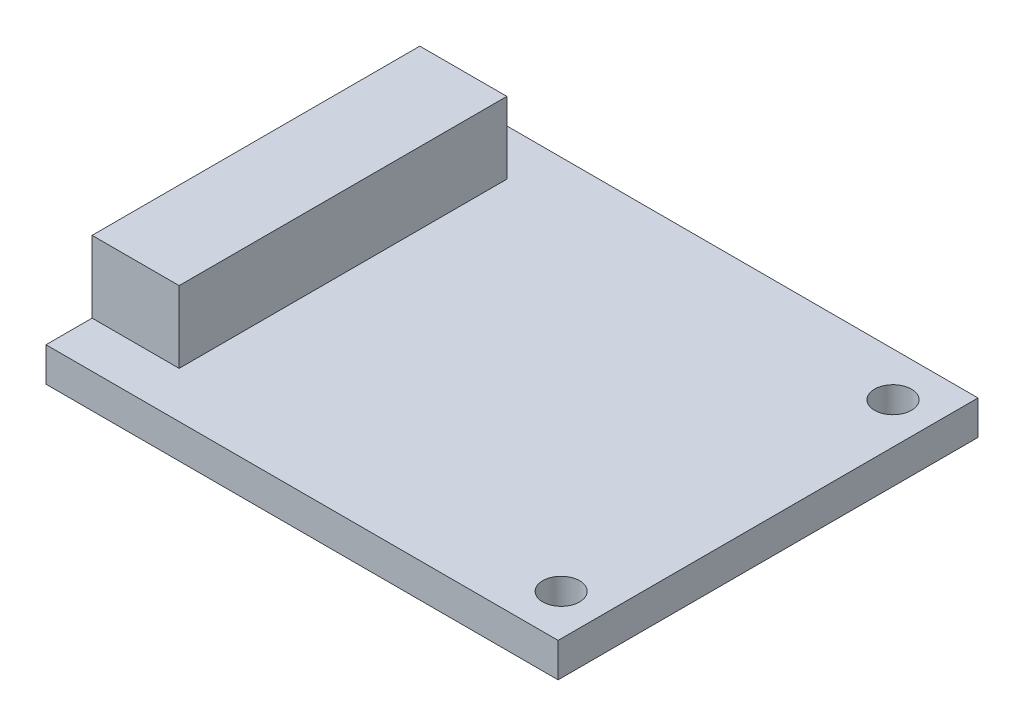
ISO-10303-21;
HEADER;
FILE_DESCRIPTION(('STEP AP214'),'2;1');
FILE_NAME('part.step','',(''),(''),'','','');
FILE_SCHEMA(('AUTOMOTIVE_DESIGN { 1 0 10303 214 1 1 1 1 }'));
ENDSEC;
DATA;
#1=APPLICATION_CONTEXT('core data for automotive mechanical design processes');
#2=APPLICATION_PROTOCOL_DEFINITION('international standard','automotive_design',2000,#1);
#3=PRODUCT_CONTEXT('',#1,'mechanical');
#4=PRODUCT('Part','Part','',(#3));
#5=PRODUCT_RELATED_PRODUCT_CATEGORY('part','',(#4));
#6=PRODUCT_DEFINITION_FORMATION('','',#4);
#7=PRODUCT_DEFINITION_CONTEXT('part definition',#1,'design');
#8=PRODUCT_DEFINITION('design','',#6,#7);
#9=PRODUCT_DEFINITION_SHAPE('','',#8);
#10=(LENGTH_UNIT() NAMED_UNIT(*) SI_UNIT(.MILLI.,.METRE.));
#11=(NAMED_UNIT(*) PLANE_ANGLE_UNIT() SI_UNIT($,.RADIAN.));
#12=(NAMED_UNIT(*) SI_UNIT($,.STERADIAN.) SOLID_ANGLE_UNIT());
#13=UNCERTAINTY_MEASURE_WITH_UNIT(LENGTH_MEASURE(1.E-05),#10,'distance_accuracy_value','');
#14=(GEOMETRIC_REPRESENTATION_CONTEXT(3) GLOBAL_UNCERTAINTY_ASSIGNED_CONTEXT((#13)) GLOBAL_UNIT_ASSIGNED_CONTEXT((#10,
#11,#12)) REPRESENTATION_CONTEXT('',''));
#15=CARTESIAN_POINT('',(0.,0.,0.));
#16=DIRECTION('',(0.,0.,1.));
#17=DIRECTION('',(1.,0.,0.));
#18=AXIS2_PLACEMENT_3D('',#15,#16,#17);
#19=CARTESIAN_POINT('',(0.,1.67,0.));
#20=DIRECTION('',(0.,-1.,0.));
#21=DIRECTION('',(0.,0.,-1.));
#22=AXIS2_PLACEMENT_3D('',#19,#20,#21);
#23=PLANE('',#22);
#24=CARTESIAN_POINT('',(23.,1.67,-2.15));
#25=DIRECTION('',(0.,1.,0.));
#26=DIRECTION('',(0.,0.,1.));
#27=AXIS2_PLACEMENT_3D('',#24,#25,#26);
#28=CIRCLE('',#27,0.899999999999998);
#29=CARTESIAN_POINT('',(23.,1.67,-1.25));
#30=VERTEX_POINT('',#29);
#31=EDGE_CURVE('E144',#30,#30,#28,.T.);
#32=ORIENTED_EDGE('',*,*,#31,.F.);
#33=EDGE_LOOP('',(#32));
#34=FACE_BOUND('',#33,.T.);
#35=CARTESIAN_POINT('',(23.,1.67,-18.35));
#36=DIRECTION('',(0.,1.,0.));
#37=DIRECTION('',(0.,0.,1.));
#38=AXIS2_PLACEMENT_3D('',#35,#36,#37);
#39=CIRCLE('',#38,0.899999999999998);
#40=CARTESIAN_POINT('',(23.,1.67,-17.45));
#41=VERTEX_POINT('',#40);
#42=EDGE_CURVE('E130',#41,#41,#39,.T.);
#43=ORIENTED_EDGE('',*,*,#42,.F.);
#44=EDGE_LOOP('',(#43));
#45=FACE_BOUND('',#44,.T.);
#46=DIRECTION('',(-1.,0.,0.));
#47=VECTOR('',#46,1.);
#48=CARTESIAN_POINT('',(0.,1.67,-18.25));
#49=LINE('',#48,#47);
#50=CARTESIAN_POINT('',(4.25,1.67,-18.25));
#51=VERTEX_POINT('',#50);
#52=CARTESIAN_POINT('',(0.,1.67,-18.25));
#53=VERTEX_POINT('',#52);
#54=EDGE_CURVE('E55',#51,#53,#49,.T.);
#55=ORIENTED_EDGE('',*,*,#54,.F.);
#56=DIRECTION('',(0.,0.,-1.));
#57=VECTOR('',#56,1.);
#58=CARTESIAN_POINT('',(4.25,1.67,-2.25));
#59=LINE('',#58,#57);
#60=CARTESIAN_POINT('',(4.25,1.67,-2.25));
#61=VERTEX_POINT('',#60);
#62=EDGE_CURVE('E208',#61,#51,#59,.T.);
#63=ORIENTED_EDGE('',*,*,#62,.F.);
#64=DIRECTION('',(1.,0.,0.));
#65=VECTOR('',#64,1.);
#66=CARTESIAN_POINT('',(0.,1.67,-2.25));
#67=LINE('',#66,#65);
#68=CARTESIAN_POINT('',(0.,1.67,-2.25));
#69=VERTEX_POINT('',#68);
#70=EDGE_CURVE('E61',#69,#61,#67,.T.);
#71=ORIENTED_EDGE('',*,*,#70,.F.);
#72=DIRECTION('',(0.,0.,1.));
#73=VECTOR('',#72,1.);
#74=CARTESIAN_POINT('',(0.,1.67,0.));
#75=LINE('',#74,#73);
#76=CARTESIAN_POINT('',(0.,1.67,0.));
#77=VERTEX_POINT('',#76);
#78=EDGE_CURVE('E128',#69,#77,#75,.T.);
#79=ORIENTED_EDGE('',*,*,#78,.T.);
#80=DIRECTION('',(1.,0.,0.));
#81=VECTOR('',#80,1.);
#82=CARTESIAN_POINT('',(0.,1.67,0.));
#83=LINE('',#82,#81);
#84=CARTESIAN_POINT('',(25.,1.67,0.));
#85=VERTEX_POINT('',#84);
#86=EDGE_CURVE('E156',#77,#85,#83,.T.);
#87=ORIENTED_EDGE('',*,*,#86,.T.);
#88=DIRECTION('',(0.,0.,-1.));
#89=VECTOR('',#88,1.);
#90=CARTESIAN_POINT('',(25.,1.67,0.));
#91=LINE('',#90,#89);
#92=CARTESIAN_POINT('',(25.,1.67,-20.5));
#93=VERTEX_POINT('',#92);
#94=EDGE_CURVE('E159',#85,#93,#91,.T.);
#95=ORIENTED_EDGE('',*,*,#94,.T.);
#96=DIRECTION('',(-1.,0.,0.));
#97=VECTOR('',#96,1.);
#98=CARTESIAN_POINT('',(0.,1.67,-20.5));
#99=LINE('',#98,#97);
#100=CARTESIAN_POINT('',(0.,1.67,-20.5));
#101=VERTEX_POINT('',#100);
#102=EDGE_CURVE('E162',#93,#101,#99,.T.);
#103=ORIENTED_EDGE('',*,*,#102,.T.);
#104=EDGE_CURVE('E153',#101,#53,#75,.T.);
#105=ORIENTED_EDGE('',*,*,#104,.T.);
#106=EDGE_LOOP('',(#55,#63,#71,#79,#87,#95,#103,#105));
#107=FACE_BOUND('',#106,.T.);
#108=ADVANCED_FACE('F39',(#34,#45,#107),#23,.F.);
#109=CARTESIAN_POINT('',(0.,1.67,0.));
#110=DIRECTION('',(1.,0.,0.));
#111=DIRECTION('',(0.,0.,-1.));
#112=AXIS2_PLACEMENT_3D('',#109,#110,#111);
#113=PLANE('',#112);
#114=DIRECTION('',(0.,0.,1.));
#115=VECTOR('',#114,1.);
#116=CARTESIAN_POINT('',(0.,0.,0.));
#117=LINE('',#116,#115);
#118=CARTESIAN_POINT('',(0.,0.,-20.5));
#119=VERTEX_POINT('',#118);
#120=CARTESIAN_POINT('',(0.,0.,0.));
#121=VERTEX_POINT('',#120);
#122=EDGE_CURVE('E152',#119,#121,#117,.T.);
#123=ORIENTED_EDGE('',*,*,#122,.T.);
#124=DIRECTION('',(0.,-1.,0.));
#125=VECTOR('',#124,1.);
#126=CARTESIAN_POINT('',(0.,1.67,0.));
#127=LINE('',#126,#125);
#128=EDGE_CURVE('E11',#77,#121,#127,.T.);
#129=ORIENTED_EDGE('',*,*,#128,.F.);
#130=ORIENTED_EDGE('',*,*,#78,.F.);
#131=DIRECTION('',(0.,-1.,0.));
#132=VECTOR('',#131,1.);
#133=CARTESIAN_POINT('',(0.,5.17,-2.25));
#134=LINE('',#133,#132);
#135=CARTESIAN_POINT('',(0.,5.17,-2.25));
#136=VERTEX_POINT('',#135);
#137=EDGE_CURVE('E108',#136,#69,#134,.T.);
#138=ORIENTED_EDGE('',*,*,#137,.F.);
#139=DIRECTION('',(0.,0.,1.));
#140=VECTOR('',#139,1.);
#141=CARTESIAN_POINT('',(0.,5.17,-2.25));
#142=LINE('',#141,#140);
#143=CARTESIAN_POINT('',(0.,5.17,-18.25));
#144=VERTEX_POINT('',#143);
#145=EDGE_CURVE('E115',#144,#136,#142,.T.);
#146=ORIENTED_EDGE('',*,*,#145,.F.);
#147=DIRECTION('',(0.,-1.,0.));
#148=VECTOR('',#147,1.);
#149=CARTESIAN_POINT('',(0.,5.17,-18.25));
#150=LINE('',#149,#148);
#151=EDGE_CURVE('E202',#144,#53,#150,.T.);
#152=ORIENTED_EDGE('',*,*,#151,.T.);
#153=ORIENTED_EDGE('',*,*,#104,.F.);
#154=DIRECTION('',(0.,-1.,0.));
#155=VECTOR('',#154,1.);
#156=CARTESIAN_POINT('',(0.,1.67,-20.5));
#157=LINE('',#156,#155);
#158=EDGE_CURVE('E165',#101,#119,#157,.T.);
#159=ORIENTED_EDGE('',*,*,#158,.T.);
#160=EDGE_LOOP('',(#123,#129,#130,#138,#146,#152,#153,#159));
#161=FACE_BOUND('',#160,.T.);
#162=ADVANCED_FACE('F41',(#161),#113,.F.);
#163=CARTESIAN_POINT('',(0.,1.67,0.));
#164=DIRECTION('',(0.,0.,-1.));
#165=DIRECTION('',(-1.,0.,0.));
#166=AXIS2_PLACEMENT_3D('',#163,#164,#165);
#167=PLANE('',#166);
#168=DIRECTION('',(1.,0.,0.));
#169=VECTOR('',#168,1.);
#170=CARTESIAN_POINT('',(0.,0.,0.));
#171=LINE('',#170,#169);
#172=CARTESIAN_POINT('',(25.,0.,0.));
#173=VERTEX_POINT('',#172);
#174=EDGE_CURVE('E168',#121,#173,#171,.T.);
#175=ORIENTED_EDGE('',*,*,#174,.T.);
#176=DIRECTION('',(0.,-1.,0.));
#177=VECTOR('',#176,1.);
#178=CARTESIAN_POINT('',(25.,1.67,0.));
#179=LINE('',#178,#177);
#180=EDGE_CURVE('E48',#85,#173,#179,.T.);
#181=ORIENTED_EDGE('',*,*,#180,.F.);
#182=ORIENTED_EDGE('',*,*,#86,.F.);
#183=ORIENTED_EDGE('',*,*,#128,.T.);
#184=EDGE_LOOP('',(#175,#181,#182,#183));
#185=FACE_BOUND('',#184,.T.);
#186=ADVANCED_FACE('F238',(#185),#167,.F.);
#187=CARTESIAN_POINT('',(25.,1.67,0.));
#188=DIRECTION('',(-1.,0.,0.));
#189=DIRECTION('',(0.,0.,1.));
#190=AXIS2_PLACEMENT_3D('',#187,#188,#189);
#191=PLANE('',#190);
#192=DIRECTION('',(0.,0.,-1.));
#193=VECTOR('',#192,1.);
#194=CARTESIAN_POINT('',(25.,0.,0.));
#195=LINE('',#194,#193);
#196=CARTESIAN_POINT('',(25.,0.,-20.5));
#197=VERTEX_POINT('',#196);
#198=EDGE_CURVE('E171',#173,#197,#195,.T.);
#199=ORIENTED_EDGE('',*,*,#198,.T.);
#200=DIRECTION('',(0.,-1.,0.));
#201=VECTOR('',#200,1.);
#202=CARTESIAN_POINT('',(25.,1.67,-20.5));
#203=LINE('',#202,#201);
#204=EDGE_CURVE('E180',#93,#197,#203,.T.);
#205=ORIENTED_EDGE('',*,*,#204,.F.);
#206=ORIENTED_EDGE('',*,*,#94,.F.);
#207=ORIENTED_EDGE('',*,*,#180,.T.);
#208=EDGE_LOOP('',(#199,#205,#206,#207));
#209=FACE_BOUND('',#208,.T.);
#210=ADVANCED_FACE('F189',(#209),#191,.F.);
#211=CARTESIAN_POINT('',(0.,1.67,-20.5));
#212=DIRECTION('',(0.,0.,1.));
#213=DIRECTION('',(1.,0.,0.));
#214=AXIS2_PLACEMENT_3D('',#211,#212,#213);
#215=PLANE('',#214);
#216=DIRECTION('',(-1.,0.,0.));
#217=VECTOR('',#216,1.);
#218=CARTESIAN_POINT('',(0.,0.,-20.5));
#219=LINE('',#218,#217);
#220=EDGE_CURVE('E174',#197,#119,#219,.T.);
#221=ORIENTED_EDGE('',*,*,#220,.T.);
#222=ORIENTED_EDGE('',*,*,#158,.F.);
#223=ORIENTED_EDGE('',*,*,#102,.F.);
#224=ORIENTED_EDGE('',*,*,#204,.T.);
#225=EDGE_LOOP('',(#221,#222,#223,#224));
#226=FACE_BOUND('',#225,.T.);
#227=ADVANCED_FACE('F199',(#226),#215,.F.);
#228=CARTESIAN_POINT('',(0.,0.,0.));
#229=DIRECTION('',(0.,-1.,0.));
#230=DIRECTION('',(0.,0.,-1.));
#231=AXIS2_PLACEMENT_3D('',#228,#229,#230);
#232=PLANE('',#231);
#233=CARTESIAN_POINT('',(23.,0.,-18.35));
#234=DIRECTION('',(0.,1.,0.));
#235=DIRECTION('',(0.,0.,1.));
#236=AXIS2_PLACEMENT_3D('',#233,#234,#235);
#237=CIRCLE('',#236,0.899999999999998);
#238=CARTESIAN_POINT('',(23.,0.,-17.45));
#239=VERTEX_POINT('',#238);
#240=EDGE_CURVE('E135',#239,#239,#237,.T.);
#241=ORIENTED_EDGE('',*,*,#240,.T.);
#242=EDGE_LOOP('',(#241));
#243=FACE_BOUND('',#242,.T.);
#244=CARTESIAN_POINT('',(23.,0.,-2.15));
#245=DIRECTION('',(0.,1.,0.));
#246=DIRECTION('',(0.,0.,1.));
#247=AXIS2_PLACEMENT_3D('',#244,#245,#246);
#248=CIRCLE('',#247,0.899999999999998);
#249=CARTESIAN_POINT('',(23.,0.,-1.25));
#250=VERTEX_POINT('',#249);
#251=EDGE_CURVE('E148',#250,#250,#248,.T.);
#252=ORIENTED_EDGE('',*,*,#251,.T.);
#253=EDGE_LOOP('',(#252));
#254=FACE_BOUND('',#253,.T.);
#255=ORIENTED_EDGE('',*,*,#122,.F.);
#256=ORIENTED_EDGE('',*,*,#220,.F.);
#257=ORIENTED_EDGE('',*,*,#198,.F.);
#258=ORIENTED_EDGE('',*,*,#174,.F.);
#259=EDGE_LOOP('',(#255,#256,#257,#258));
#260=FACE_BOUND('',#259,.T.);
#261=ADVANCED_FACE('F196',(#243,#254,#260),#232,.T.);
#262=CARTESIAN_POINT('',(23.,1.67,-2.15));
#263=DIRECTION('',(0.,1.,0.));
#264=DIRECTION('',(0.,0.,1.));
#265=AXIS2_PLACEMENT_3D('',#262,#263,#264);
#266=CYLINDRICAL_SURFACE('',#265,0.899999999999998);
#267=ORIENTED_EDGE('',*,*,#251,.F.);
#268=EDGE_LOOP('',(#267));
#269=FACE_BOUND('',#268,.T.);
#270=ORIENTED_EDGE('',*,*,#31,.T.);
#271=EDGE_LOOP('',(#270));
#272=FACE_BOUND('',#271,.T.);
#273=ADVANCED_FACE('F243',(#269,#272),#266,.F.);
#274=CARTESIAN_POINT('',(23.,1.67,-18.35));
#275=DIRECTION('',(0.,1.,0.));
#276=DIRECTION('',(0.,0.,1.));
#277=AXIS2_PLACEMENT_3D('',#274,#275,#276);
#278=CYLINDRICAL_SURFACE('',#277,0.899999999999998);
#279=ORIENTED_EDGE('',*,*,#240,.F.);
#280=EDGE_LOOP('',(#279));
#281=FACE_BOUND('',#280,.T.);
#282=ORIENTED_EDGE('',*,*,#42,.T.);
#283=EDGE_LOOP('',(#282));
#284=FACE_BOUND('',#283,.T.);
#285=ADVANCED_FACE('F230',(#281,#284),#278,.F.);
#286=CARTESIAN_POINT('',(0.,5.17,-2.25));
#287=DIRECTION('',(0.,0.,-1.));
#288=DIRECTION('',(-1.,0.,0.));
#289=AXIS2_PLACEMENT_3D('',#286,#287,#288);
#290=PLANE('',#289);
#291=ORIENTED_EDGE('',*,*,#70,.T.);
#292=DIRECTION('',(0.,-1.,0.));
#293=VECTOR('',#292,1.);
#294=CARTESIAN_POINT('',(4.25,5.17,-2.25));
#295=LINE('',#294,#293);
#296=CARTESIAN_POINT('',(4.25,5.17,-2.25));
#297=VERTEX_POINT('',#296);
#298=EDGE_CURVE('E110',#297,#61,#295,.T.);
#299=ORIENTED_EDGE('',*,*,#298,.F.);
#300=DIRECTION('',(1.,0.,0.));
#301=VECTOR('',#300,1.);
#302=CARTESIAN_POINT('',(0.,5.17,-2.25));
#303=LINE('',#302,#301);
#304=EDGE_CURVE('E104',#136,#297,#303,.T.);
#305=ORIENTED_EDGE('',*,*,#304,.F.);
#306=ORIENTED_EDGE('',*,*,#137,.T.);
#307=EDGE_LOOP('',(#291,#299,#305,#306));
#308=FACE_BOUND('',#307,.T.);
#309=ADVANCED_FACE('F106',(#308),#290,.F.);
#310=CARTESIAN_POINT('',(4.25,5.17,-2.25));
#311=DIRECTION('',(-1.,0.,0.));
#312=DIRECTION('',(0.,0.,1.));
#313=AXIS2_PLACEMENT_3D('',#310,#311,#312);
#314=PLANE('',#313);
#315=ORIENTED_EDGE('',*,*,#62,.T.);
#316=DIRECTION('',(0.,-1.,0.));
#317=VECTOR('',#316,1.);
#318=CARTESIAN_POINT('',(4.25,5.17,-18.25));
#319=LINE('',#318,#317);
#320=CARTESIAN_POINT('',(4.25,5.17,-18.25));
#321=VERTEX_POINT('',#320);
#322=EDGE_CURVE('E137',#321,#51,#319,.T.);
#323=ORIENTED_EDGE('',*,*,#322,.F.);
#324=DIRECTION('',(0.,0.,-1.));
#325=VECTOR('',#324,1.);
#326=CARTESIAN_POINT('',(4.25,5.17,-2.25));
#327=LINE('',#326,#325);
#328=EDGE_CURVE('E114',#297,#321,#327,.T.);
#329=ORIENTED_EDGE('',*,*,#328,.F.);
#330=ORIENTED_EDGE('',*,*,#298,.T.);
#331=EDGE_LOOP('',(#315,#323,#329,#330));
#332=FACE_BOUND('',#331,.T.);
#333=ADVANCED_FACE('F222',(#332),#314,.F.);
#334=CARTESIAN_POINT('',(0.,5.17,-18.25));
#335=DIRECTION('',(0.,0.,1.));
#336=DIRECTION('',(1.,0.,0.));
#337=AXIS2_PLACEMENT_3D('',#334,#335,#336);
#338=PLANE('',#337);
#339=ORIENTED_EDGE('',*,*,#54,.T.);
#340=ORIENTED_EDGE('',*,*,#151,.F.);
#341=DIRECTION('',(-1.,0.,0.));
#342=VECTOR('',#341,1.);
#343=CARTESIAN_POINT('',(0.,5.17,-18.25));
#344=LINE('',#343,#342);
#345=EDGE_CURVE('E120',#321,#144,#344,.T.);
#346=ORIENTED_EDGE('',*,*,#345,.F.);
#347=ORIENTED_EDGE('',*,*,#322,.T.);
#348=EDGE_LOOP('',(#339,#340,#346,#347));
#349=FACE_BOUND('',#348,.T.);
#350=ADVANCED_FACE('F205',(#349),#338,.F.);
#351=CARTESIAN_POINT('',(0.,5.17,0.));
#352=DIRECTION('',(0.,-1.,0.));
#353=DIRECTION('',(0.,0.,-1.));
#354=AXIS2_PLACEMENT_3D('',#351,#352,#353);
#355=PLANE('',#354);
#356=ORIENTED_EDGE('',*,*,#145,.T.);
#357=ORIENTED_EDGE('',*,*,#304,.T.);
#358=ORIENTED_EDGE('',*,*,#328,.T.);
#359=ORIENTED_EDGE('',*,*,#345,.T.);
#360=EDGE_LOOP('',(#356,#357,#358,#359));
#361=FACE_BOUND('',#360,.T.);
#362=ADVANCED_FACE('F118',(#361),#355,.F.);
#363=CLOSED_SHELL('',(#108,#162,#186,#210,#227,#261,#273,#285,#309,#333,#350,#362));
#364=MANIFOLD_SOLID_BREP('B2',#363);
#365=ADVANCED_BREP_SHAPE_REPRESENTATION('',(#18,#364),#14);
#366=SHAPE_DEFINITION_REPRESENTATION(#9,#365);
ENDSEC;
END-ISO-10303-21;
